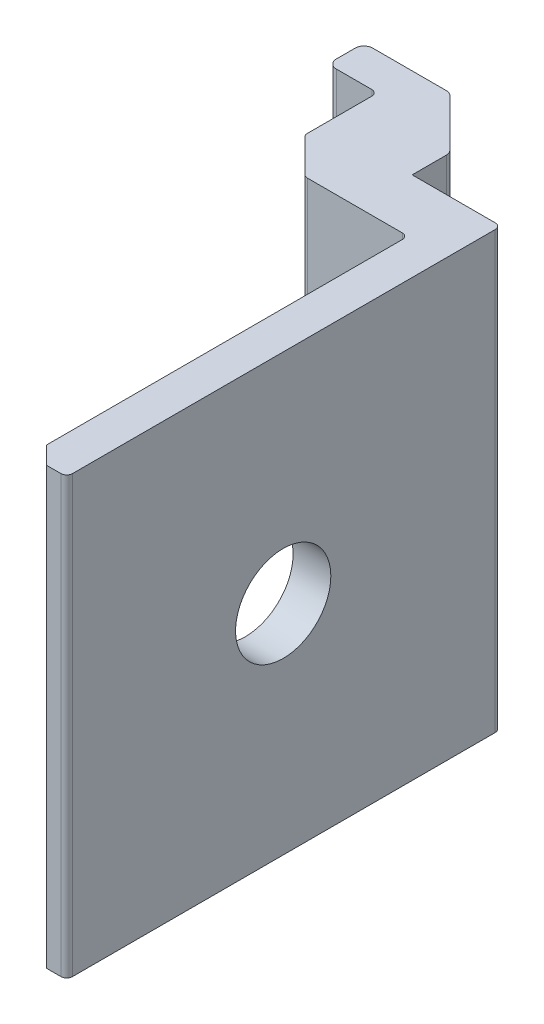
ISO-10303-21;
HEADER;
FILE_DESCRIPTION(('STEP AP214'),'2;1');
FILE_NAME('part.step','',(''),(''),'','','');
FILE_SCHEMA(('AUTOMOTIVE_DESIGN { 1 0 10303 214 1 1 1 1 }'));
ENDSEC;
DATA;
#1=APPLICATION_CONTEXT('core data for automotive mechanical design processes');
#2=APPLICATION_PROTOCOL_DEFINITION('international standard','automotive_design',2000,#1);
#3=PRODUCT_CONTEXT('',#1,'mechanical');
#4=PRODUCT('Part','Part','',(#3));
#5=PRODUCT_RELATED_PRODUCT_CATEGORY('part','',(#4));
#6=PRODUCT_DEFINITION_FORMATION('','',#4);
#7=PRODUCT_DEFINITION_CONTEXT('part definition',#1,'design');
#8=PRODUCT_DEFINITION('design','',#6,#7);
#9=PRODUCT_DEFINITION_SHAPE('','',#8);
#10=(LENGTH_UNIT() NAMED_UNIT(*) SI_UNIT(.MILLI.,.METRE.));
#11=(NAMED_UNIT(*) PLANE_ANGLE_UNIT() SI_UNIT($,.RADIAN.));
#12=(NAMED_UNIT(*) SI_UNIT($,.STERADIAN.) SOLID_ANGLE_UNIT());
#13=UNCERTAINTY_MEASURE_WITH_UNIT(LENGTH_MEASURE(1.E-05),#10,'distance_accuracy_value','');
#14=(GEOMETRIC_REPRESENTATION_CONTEXT(3) GLOBAL_UNCERTAINTY_ASSIGNED_CONTEXT((#13)) GLOBAL_UNIT_ASSIGNED_CONTEXT((#10,
#11,#12)) REPRESENTATION_CONTEXT('',''));
#15=CARTESIAN_POINT('',(0.,0.,0.));
#16=DIRECTION('',(0.,0.,1.));
#17=DIRECTION('',(1.,0.,0.));
#18=AXIS2_PLACEMENT_3D('',#15,#16,#17);
#19=CARTESIAN_POINT('',(-7.66487150235317,-38.1,-3.49745148248165));
#20=DIRECTION('',(0.707106781186537,0.,-0.707106781186558));
#21=DIRECTION('',(-0.707106781186558,0.,-0.707106781186537));
#22=AXIS2_PLACEMENT_3D('',#19,#20,#21);
#23=PLANE('',#22);
#24=DIRECTION('',(-0.707106781186558,0.,-0.707106781186537));
#25=VECTOR('',#24,1.);
#26=CARTESIAN_POINT('',(-7.66487150235317,0.,-3.49745148248165));
#27=LINE('',#26,#25);
#28=CARTESIAN_POINT('',(-7.88805613508904,0.,-3.72063611521751));
#29=VERTEX_POINT('',#28);
#30=CARTESIAN_POINT('',(-12.0136868696175,0.,-7.84626684974582));
#31=VERTEX_POINT('',#30);
#32=EDGE_CURVE('E237',#29,#31,#27,.T.);
#33=ORIENTED_EDGE('',*,*,#32,.F.);
#34=DIRECTION('',(0.,1.,0.));
#35=VECTOR('',#34,1.);
#36=CARTESIAN_POINT('',(-7.88805613508904,-38.1,-3.72063611521751));
#37=LINE('',#36,#35);
#38=CARTESIAN_POINT('',(-7.88805613508904,-38.1,-3.72063611521751));
#39=VERTEX_POINT('',#38);
#40=EDGE_CURVE('E329',#29,#39,#37,.F.);
#41=ORIENTED_EDGE('',*,*,#40,.T.);
#42=DIRECTION('',(-0.707106781186558,0.,-0.707106781186537));
#43=VECTOR('',#42,1.);
#44=CARTESIAN_POINT('',(-7.66487150235317,-38.1,-3.49745148248165));
#45=LINE('',#44,#43);
#46=CARTESIAN_POINT('',(-12.0136868696175,-38.1,-7.84626684974582));
#47=VERTEX_POINT('',#46);
#48=EDGE_CURVE('E377',#39,#47,#45,.T.);
#49=ORIENTED_EDGE('',*,*,#48,.T.);
#50=DIRECTION('',(0.,1.,0.));
#51=VECTOR('',#50,1.);
#52=CARTESIAN_POINT('',(-12.0136868696175,-38.1,-7.84626684974582));
#53=LINE('',#52,#51);
#54=EDGE_CURVE('E445',#47,#31,#53,.T.);
#55=ORIENTED_EDGE('',*,*,#54,.T.);
#56=EDGE_LOOP('',(#33,#41,#49,#55));
#57=FACE_BOUND('',#56,.T.);
#58=ADVANCED_FACE('F37',(#57),#23,.T.);
#59=CARTESIAN_POINT('',(-7.6648715023532,-38.1,-0.195451482481614));
#60=DIRECTION('',(1.,0.,0.));
#61=DIRECTION('',(0.,0.,-1.));
#62=AXIS2_PLACEMENT_3D('',#59,#60,#61);
#63=PLANE('',#62);
#64=DIRECTION('',(0.,0.,-1.));
#65=VECTOR('',#64,1.);
#66=CARTESIAN_POINT('',(-7.6648715023532,-38.1,-0.195451482481614));
#67=LINE('',#66,#65);
#68=CARTESIAN_POINT('',(-7.6648715023532,-38.1,-0.195451482481614));
#69=VERTEX_POINT('',#68);
#70=CARTESIAN_POINT('',(-7.66487150235318,-38.1,-3.18182074795334));
#71=VERTEX_POINT('',#70);
#72=EDGE_CURVE('E216',#69,#71,#67,.T.);
#73=ORIENTED_EDGE('',*,*,#72,.T.);
#74=DIRECTION('',(0.,1.,0.));
#75=VECTOR('',#74,1.);
#76=CARTESIAN_POINT('',(-7.66487150235318,-38.1,-3.18182074795334));
#77=LINE('',#76,#75);
#78=CARTESIAN_POINT('',(-7.66487150235318,0.,-3.18182074795334));
#79=VERTEX_POINT('',#78);
#80=EDGE_CURVE('E311',#71,#79,#77,.T.);
#81=ORIENTED_EDGE('',*,*,#80,.T.);
#82=DIRECTION('',(0.,0.,-1.));
#83=VECTOR('',#82,1.);
#84=CARTESIAN_POINT('',(-7.6648715023532,0.,-0.195451482481614));
#85=LINE('',#84,#83);
#86=CARTESIAN_POINT('',(-7.6648715023532,0.,-0.195451482481614));
#87=VERTEX_POINT('',#86);
#88=EDGE_CURVE('E381',#87,#79,#85,.T.);
#89=ORIENTED_EDGE('',*,*,#88,.F.);
#90=DIRECTION('',(0.,1.,0.));
#91=VECTOR('',#90,1.);
#92=CARTESIAN_POINT('',(-7.6648715023532,-38.1,-0.195451482481614));
#93=LINE('',#92,#91);
#94=EDGE_CURVE('E411',#69,#87,#93,.T.);
#95=ORIENTED_EDGE('',*,*,#94,.F.);
#96=EDGE_LOOP('',(#73,#81,#89,#95));
#97=FACE_BOUND('',#96,.T.);
#98=ADVANCED_FACE('F439',(#97),#63,.T.);
#99=CARTESIAN_POINT('',(0.107528497646751,-38.1,-0.195451482481621));
#100=DIRECTION('',(0.,0.,-1.));
#101=DIRECTION('',(-1.,0.,0.));
#102=AXIS2_PLACEMENT_3D('',#99,#100,#101);
#103=PLANE('',#102);
#104=DIRECTION('',(-1.,0.,0.));
#105=VECTOR('',#104,1.);
#106=CARTESIAN_POINT('',(0.107528497646751,0.,-0.195451482481621));
#107=LINE('',#106,#105);
#108=CARTESIAN_POINT('',(-0.40047150235325,0.,-0.19545148248162));
#109=VERTEX_POINT('',#108);
#110=EDGE_CURVE('E408',#109,#87,#107,.T.);
#111=ORIENTED_EDGE('',*,*,#110,.F.);
#112=DIRECTION('',(0.,1.,0.));
#113=VECTOR('',#112,1.);
#114=CARTESIAN_POINT('',(-0.40047150235325,-38.1,-0.19545148248162));
#115=LINE('',#114,#113);
#116=CARTESIAN_POINT('',(-0.40047150235325,-38.1,-0.19545148248162));
#117=VERTEX_POINT('',#116);
#118=EDGE_CURVE('E276',#109,#117,#115,.F.);
#119=ORIENTED_EDGE('',*,*,#118,.T.);
#120=DIRECTION('',(-1.,0.,0.));
#121=VECTOR('',#120,1.);
#122=CARTESIAN_POINT('',(0.107528497646751,-38.1,-0.195451482481621));
#123=LINE('',#122,#121);
#124=EDGE_CURVE('E233',#117,#69,#123,.T.);
#125=ORIENTED_EDGE('',*,*,#124,.T.);
#126=ORIENTED_EDGE('',*,*,#94,.T.);
#127=EDGE_LOOP('',(#111,#119,#125,#126));
#128=FACE_BOUND('',#127,.T.);
#129=ADVANCED_FACE('F434',(#128),#103,.T.);
#130=CARTESIAN_POINT('',(0.10752849764675,-38.1,37.7877085175183));
#131=DIRECTION('',(1.,0.,0.));
#132=DIRECTION('',(0.,0.,-1.));
#133=AXIS2_PLACEMENT_3D('',#130,#131,#132);
#134=PLANE('',#133);
#135=CARTESIAN_POINT('',(0.107528497646751,-19.05,18.8545485175184));
#136=DIRECTION('',(1.,0.,0.));
#137=DIRECTION('',(0.,0.,-1.));
#138=AXIS2_PLACEMENT_3D('',#135,#136,#137);
#139=CIRCLE('',#138,4.16560000000001);
#140=CARTESIAN_POINT('',(0.107528497646751,-19.05,14.6889485175183));
#141=VERTEX_POINT('',#140);
#142=EDGE_CURVE('E374',#141,#141,#139,.T.);
#143=ORIENTED_EDGE('',*,*,#142,.F.);
#144=EDGE_LOOP('',(#143));
#145=FACE_BOUND('',#144,.T.);
#146=DIRECTION('',(0.,0.,-1.));
#147=VECTOR('',#146,1.);
#148=CARTESIAN_POINT('',(0.10752849764675,-38.1,37.7877085175183));
#149=LINE('',#148,#147);
#150=CARTESIAN_POINT('',(0.10752849764675,-38.1,37.2797085175183));
#151=VERTEX_POINT('',#150);
#152=CARTESIAN_POINT('',(0.107528497646751,-38.1,0.312548517518378));
#153=VERTEX_POINT('',#152);
#154=EDGE_CURVE('E226',#151,#153,#149,.T.);
#155=ORIENTED_EDGE('',*,*,#154,.T.);
#156=DIRECTION('',(0.,1.,0.));
#157=VECTOR('',#156,1.);
#158=CARTESIAN_POINT('',(0.107528497646751,-38.1,0.312548517518378));
#159=LINE('',#158,#157);
#160=CARTESIAN_POINT('',(0.107528497646751,0.,0.312548517518378));
#161=VERTEX_POINT('',#160);
#162=EDGE_CURVE('E265',#153,#161,#159,.T.);
#163=ORIENTED_EDGE('',*,*,#162,.T.);
#164=DIRECTION('',(0.,0.,-1.));
#165=VECTOR('',#164,1.);
#166=CARTESIAN_POINT('',(0.10752849764675,0.,37.7877085175183));
#167=LINE('',#166,#165);
#168=CARTESIAN_POINT('',(0.10752849764675,0.,37.2797085175183));
#169=VERTEX_POINT('',#168);
#170=EDGE_CURVE('E405',#169,#161,#167,.T.);
#171=ORIENTED_EDGE('',*,*,#170,.F.);
#172=DIRECTION('',(0.,1.,0.));
#173=VECTOR('',#172,1.);
#174=CARTESIAN_POINT('',(0.10752849764675,-38.1,37.2797085175183));
#175=LINE('',#174,#173);
#176=EDGE_CURVE('E262',#169,#151,#175,.F.);
#177=ORIENTED_EDGE('',*,*,#176,.T.);
#178=EDGE_LOOP('',(#155,#163,#171,#177));
#179=FACE_BOUND('',#178,.T.);
#180=ADVANCED_FACE('F422',(#145,#179),#134,.T.);
#181=CARTESIAN_POINT('',(-1.67047150235335,-38.1,37.7877085175183));
#182=DIRECTION('',(0.,0.,1.));
#183=DIRECTION('',(1.,0.,0.));
#184=AXIS2_PLACEMENT_3D('',#181,#182,#183);
#185=PLANE('',#184);
#186=DIRECTION('',(1.,0.,0.));
#187=VECTOR('',#186,1.);
#188=CARTESIAN_POINT('',(-1.67047150235335,-38.1,37.7877085175183));
#189=LINE('',#188,#187);
#190=CARTESIAN_POINT('',(-1.67047150235335,-38.1,37.7877085175183));
#191=VERTEX_POINT('',#190);
#192=CARTESIAN_POINT('',(-0.400471502353258,-38.1,37.7877085175183));
#193=VERTEX_POINT('',#192);
#194=EDGE_CURVE('E222',#191,#193,#189,.T.);
#195=ORIENTED_EDGE('',*,*,#194,.T.);
#196=DIRECTION('',(0.,1.,0.));
#197=VECTOR('',#196,1.);
#198=CARTESIAN_POINT('',(-0.400471502353258,-38.1,37.7877085175183));
#199=LINE('',#198,#197);
#200=CARTESIAN_POINT('',(-0.400471502353258,0.,37.7877085175183));
#201=VERTEX_POINT('',#200);
#202=EDGE_CURVE('E287',#193,#201,#199,.T.);
#203=ORIENTED_EDGE('',*,*,#202,.T.);
#204=DIRECTION('',(1.,0.,0.));
#205=VECTOR('',#204,1.);
#206=CARTESIAN_POINT('',(-1.67047150235335,0.,37.7877085175183));
#207=LINE('',#206,#205);
#208=CARTESIAN_POINT('',(-1.67047150235335,0.,37.7877085175183));
#209=VERTEX_POINT('',#208);
#210=EDGE_CURVE('E400',#209,#201,#207,.T.);
#211=ORIENTED_EDGE('',*,*,#210,.F.);
#212=DIRECTION('',(0.,1.,0.));
#213=VECTOR('',#212,1.);
#214=CARTESIAN_POINT('',(-1.67047150235335,-38.1,37.7877085175183));
#215=LINE('',#214,#213);
#216=EDGE_CURVE('E215',#191,#209,#215,.T.);
#217=ORIENTED_EDGE('',*,*,#216,.F.);
#218=EDGE_LOOP('',(#195,#203,#211,#217));
#219=FACE_BOUND('',#218,.T.);
#220=ADVANCED_FACE('F416',(#219),#185,.T.);
#221=CARTESIAN_POINT('',(-3.1944715023533,-38.1,36.2637085175183));
#222=DIRECTION('',(-0.70710678118655,0.,0.707106781186545));
#223=DIRECTION('',(0.707106781186545,0.,0.70710678118655));
#224=AXIS2_PLACEMENT_3D('',#221,#222,#223);
#225=PLANE('',#224);
#226=DIRECTION('',(0.707106781186545,0.,0.70710678118655));
#227=VECTOR('',#226,1.);
#228=CARTESIAN_POINT('',(-3.1944715023533,0.,36.2637085175183));
#229=LINE('',#228,#227);
#230=CARTESIAN_POINT('',(-3.1944715023533,0.,36.2637085175183));
#231=VERTEX_POINT('',#230);
#232=EDGE_CURVE('E213',#231,#209,#229,.T.);
#233=ORIENTED_EDGE('',*,*,#232,.F.);
#234=DIRECTION('',(0.,1.,0.));
#235=VECTOR('',#234,1.);
#236=CARTESIAN_POINT('',(-3.1944715023533,-38.1,36.2637085175183));
#237=LINE('',#236,#235);
#238=CARTESIAN_POINT('',(-3.1944715023533,-38.1,36.2637085175183));
#239=VERTEX_POINT('',#238);
#240=EDGE_CURVE('E199',#239,#231,#237,.T.);
#241=ORIENTED_EDGE('',*,*,#240,.F.);
#242=DIRECTION('',(0.707106781186545,0.,0.70710678118655));
#243=VECTOR('',#242,1.);
#244=CARTESIAN_POINT('',(-3.1944715023533,-38.1,36.2637085175183));
#245=LINE('',#244,#243);
#246=EDGE_CURVE('E206',#239,#191,#245,.T.);
#247=ORIENTED_EDGE('',*,*,#246,.T.);
#248=ORIENTED_EDGE('',*,*,#216,.T.);
#249=EDGE_LOOP('',(#233,#241,#247,#248));
#250=FACE_BOUND('',#249,.T.);
#251=ADVANCED_FACE('F211',(#250),#225,.T.);
#252=CARTESIAN_POINT('',(-3.19447150235327,-38.1,4.63054851751842));
#253=DIRECTION('',(-1.,0.,0.));
#254=DIRECTION('',(0.,0.,1.));
#255=AXIS2_PLACEMENT_3D('',#252,#253,#254);
#256=PLANE('',#255);
#257=CARTESIAN_POINT('',(-3.19447150235328,-19.05,18.8545485175184));
#258=DIRECTION('',(-1.,0.,0.));
#259=DIRECTION('',(0.,0.,1.));
#260=AXIS2_PLACEMENT_3D('',#257,#258,#259);
#261=CIRCLE('',#260,4.16560000000001);
#262=CARTESIAN_POINT('',(-3.19447150235329,-19.05,23.0201485175184));
#263=VERTEX_POINT('',#262);
#264=EDGE_CURVE('E324',#263,#263,#261,.T.);
#265=ORIENTED_EDGE('',*,*,#264,.F.);
#266=EDGE_LOOP('',(#265));
#267=FACE_BOUND('',#266,.T.);
#268=DIRECTION('',(0.,0.,1.));
#269=VECTOR('',#268,1.);
#270=CARTESIAN_POINT('',(-3.19447150235327,0.,4.63054851751842));
#271=LINE('',#270,#269);
#272=CARTESIAN_POINT('',(-3.19447150235327,0.,5.13854851751842));
#273=VERTEX_POINT('',#272);
#274=EDGE_CURVE('E397',#273,#231,#271,.T.);
#275=ORIENTED_EDGE('',*,*,#274,.F.);
#276=DIRECTION('',(0.,1.,0.));
#277=VECTOR('',#276,1.);
#278=CARTESIAN_POINT('',(-3.19447150235327,-38.1,5.13854851751842));
#279=LINE('',#278,#277);
#280=CARTESIAN_POINT('',(-3.19447150235327,-38.1,5.13854851751842));
#281=VERTEX_POINT('',#280);
#282=EDGE_CURVE('E202',#273,#281,#279,.F.);
#283=ORIENTED_EDGE('',*,*,#282,.T.);
#284=DIRECTION('',(0.,0.,1.));
#285=VECTOR('',#284,1.);
#286=CARTESIAN_POINT('',(-3.19447150235327,-38.1,4.63054851751842));
#287=LINE('',#286,#285);
#288=EDGE_CURVE('E195',#281,#239,#287,.T.);
#289=ORIENTED_EDGE('',*,*,#288,.T.);
#290=ORIENTED_EDGE('',*,*,#240,.T.);
#291=EDGE_LOOP('',(#275,#283,#289,#290));
#292=FACE_BOUND('',#291,.T.);
#293=ADVANCED_FACE('F198',(#267,#292),#256,.T.);
#294=CARTESIAN_POINT('',(-12.2114715023532,-38.1,4.63054851751842));
#295=DIRECTION('',(0.,0.,1.));
#296=DIRECTION('',(1.,0.,0.));
#297=AXIS2_PLACEMENT_3D('',#294,#295,#296);
#298=PLANE('',#297);
#299=DIRECTION('',(1.,0.,0.));
#300=VECTOR('',#299,1.);
#301=CARTESIAN_POINT('',(-12.2114715023532,0.,4.63054851751842));
#302=LINE('',#301,#300);
#303=CARTESIAN_POINT('',(-12.0010510126677,0.,4.63054851751842));
#304=VERTEX_POINT('',#303);
#305=CARTESIAN_POINT('',(-3.70247150235327,0.,4.63054851751842));
#306=VERTEX_POINT('',#305);
#307=EDGE_CURVE('E398',#304,#306,#302,.T.);
#308=ORIENTED_EDGE('',*,*,#307,.F.);
#309=DIRECTION('',(0.,1.,0.));
#310=VECTOR('',#309,1.);
#311=CARTESIAN_POINT('',(-12.0010510126677,-38.1,4.63054851751842));
#312=LINE('',#311,#310);
#313=CARTESIAN_POINT('',(-12.0010510126677,-38.1,4.63054851751842));
#314=VERTEX_POINT('',#313);
#315=EDGE_CURVE('E299',#304,#314,#312,.F.);
#316=ORIENTED_EDGE('',*,*,#315,.T.);
#317=DIRECTION('',(1.,0.,0.));
#318=VECTOR('',#317,1.);
#319=CARTESIAN_POINT('',(-12.2114715023532,-38.1,4.63054851751842));
#320=LINE('',#319,#318);
#321=CARTESIAN_POINT('',(-3.70247150235327,-38.1,4.63054851751842));
#322=VERTEX_POINT('',#321);
#323=EDGE_CURVE('E207',#314,#322,#320,.T.);
#324=ORIENTED_EDGE('',*,*,#323,.T.);
#325=DIRECTION('',(0.,1.,0.));
#326=VECTOR('',#325,1.);
#327=CARTESIAN_POINT('',(-3.70247150235327,0.,4.63054851751842));
#328=LINE('',#327,#326);
#329=EDGE_CURVE('E296',#322,#306,#328,.T.);
#330=ORIENTED_EDGE('',*,*,#329,.T.);
#331=EDGE_LOOP('',(#308,#316,#324,#330));
#332=FACE_BOUND('',#331,.T.);
#333=ADVANCED_FACE('F391',(#332),#298,.T.);
#334=CARTESIAN_POINT('',(-15.3864715023532,-38.1,1.45554851751837));
#335=DIRECTION('',(-0.707106781186548,0.,0.707106781186547));
#336=DIRECTION('',(0.707106781186547,0.,0.707106781186548));
#337=AXIS2_PLACEMENT_3D('',#334,#335,#336);
#338=PLANE('',#337);
#339=DIRECTION('',(0.707106781186547,0.,0.707106781186548));
#340=VECTOR('',#339,1.);
#341=CARTESIAN_POINT('',(-15.3864715023532,-38.1,1.45554851751837));
#342=LINE('',#341,#340);
#343=CARTESIAN_POINT('',(-15.237681747196,-38.1,1.6043382726756));
#344=VERTEX_POINT('',#343);
#345=CARTESIAN_POINT('',(-12.3602612575104,-38.1,4.48175876236118));
#346=VERTEX_POINT('',#345);
#347=EDGE_CURVE('E384',#344,#346,#342,.T.);
#348=ORIENTED_EDGE('',*,*,#347,.T.);
#349=DIRECTION('',(0.,1.,0.));
#350=VECTOR('',#349,1.);
#351=CARTESIAN_POINT('',(-12.3602612575104,-38.1,4.48175876236118));
#352=LINE('',#351,#350);
#353=CARTESIAN_POINT('',(-12.3602612575104,0.,4.48175876236118));
#354=VERTEX_POINT('',#353);
#355=EDGE_CURVE('E293',#346,#354,#352,.T.);
#356=ORIENTED_EDGE('',*,*,#355,.T.);
#357=DIRECTION('',(0.707106781186547,0.,0.707106781186548));
#358=VECTOR('',#357,1.);
#359=CARTESIAN_POINT('',(-15.3864715023532,0.,1.45554851751837));
#360=LINE('',#359,#358);
#361=CARTESIAN_POINT('',(-15.237681747196,0.,1.6043382726756));
#362=VERTEX_POINT('',#361);
#363=EDGE_CURVE('E247',#362,#354,#360,.T.);
#364=ORIENTED_EDGE('',*,*,#363,.F.);
#365=DIRECTION('',(0.,1.,0.));
#366=VECTOR('',#365,1.);
#367=CARTESIAN_POINT('',(-15.237681747196,-38.1,1.6043382726756));
#368=LINE('',#367,#366);
#369=EDGE_CURVE('E291',#362,#344,#368,.F.);
#370=ORIENTED_EDGE('',*,*,#369,.T.);
#371=EDGE_LOOP('',(#348,#356,#364,#370));
#372=FACE_BOUND('',#371,.T.);
#373=ADVANCED_FACE('F649',(#372),#338,.T.);
#374=CARTESIAN_POINT('',(-15.3864715023534,-38.1,-8.06945148248188));
#375=DIRECTION('',(-1.,0.,0.));
#376=DIRECTION('',(0.,0.,1.));
#377=AXIS2_PLACEMENT_3D('',#374,#375,#376);
#378=PLANE('',#377);
#379=DIRECTION('',(0.,0.,1.));
#380=VECTOR('',#379,1.);
#381=CARTESIAN_POINT('',(-15.3864715023534,0.,-8.06945148248188));
#382=LINE('',#381,#380);
#383=CARTESIAN_POINT('',(-15.3864715023533,0.,-4.38645148248196));
#384=VERTEX_POINT('',#383);
#385=CARTESIAN_POINT('',(-15.3864715023532,0.,1.24512802783285));
#386=VERTEX_POINT('',#385);
#387=EDGE_CURVE('E244',#384,#386,#382,.T.);
#388=ORIENTED_EDGE('',*,*,#387,.F.);
#389=DIRECTION('',(0.,1.,0.));
#390=VECTOR('',#389,1.);
#391=CARTESIAN_POINT('',(-15.3864715023533,-38.1,-4.38645148248193));
#392=LINE('',#391,#390);
#393=CARTESIAN_POINT('',(-15.3864715023533,-38.1,-4.38645148248193));
#394=VERTEX_POINT('',#393);
#395=EDGE_CURVE('E259',#384,#394,#392,.F.);
#396=ORIENTED_EDGE('',*,*,#395,.T.);
#397=DIRECTION('',(0.,0.,1.));
#398=VECTOR('',#397,1.);
#399=CARTESIAN_POINT('',(-15.3864715023534,-38.1,-8.06945148248188));
#400=LINE('',#399,#398);
#401=CARTESIAN_POINT('',(-15.3864715023532,-38.1,1.24512802783285));
#402=VERTEX_POINT('',#401);
#403=EDGE_CURVE('E253',#394,#402,#400,.T.);
#404=ORIENTED_EDGE('',*,*,#403,.T.);
#405=DIRECTION('',(0.,1.,0.));
#406=VECTOR('',#405,1.);
#407=CARTESIAN_POINT('',(-15.3864715023532,-38.1,1.24512802783285));
#408=LINE('',#407,#406);
#409=EDGE_CURVE('E256',#402,#386,#408,.T.);
#410=ORIENTED_EDGE('',*,*,#409,.T.);
#411=EDGE_LOOP('',(#388,#396,#404,#410));
#412=FACE_BOUND('',#411,.T.);
#413=ADVANCED_FACE('F598',(#412),#378,.T.);
#414=CARTESIAN_POINT('',(-12.2368715023533,-38.1,-8.06945148248164));
#415=DIRECTION('',(0.,0.,-1.));
#416=DIRECTION('',(-1.,0.,0.));
#417=AXIS2_PLACEMENT_3D('',#414,#415,#416);
#418=PLANE('',#417);
#419=DIRECTION('',(-1.,0.,0.));
#420=VECTOR('',#419,1.);
#421=CARTESIAN_POINT('',(-12.2368715023533,-38.1,-8.06945148248164));
#422=LINE('',#421,#420);
#423=CARTESIAN_POINT('',(-12.5525022368815,-38.1,-8.06945148248166));
#424=VERTEX_POINT('',#423);
#425=CARTESIAN_POINT('',(-18.9932715023532,-38.1,-8.06945148248215));
#426=VERTEX_POINT('',#425);
#427=EDGE_CURVE('E380',#424,#426,#422,.T.);
#428=ORIENTED_EDGE('',*,*,#427,.T.);
#429=DIRECTION('',(0.,-1.,0.));
#430=VECTOR('',#429,1.);
#431=CARTESIAN_POINT('',(-18.9932715023532,0.,-8.06945148248215));
#432=LINE('',#431,#430);
#433=CARTESIAN_POINT('',(-18.9932715023532,0.,-8.06945148248215));
#434=VERTEX_POINT('',#433);
#435=EDGE_CURVE('E11',#426,#434,#432,.F.);
#436=ORIENTED_EDGE('',*,*,#435,.T.);
#437=DIRECTION('',(-1.,0.,0.));
#438=VECTOR('',#437,1.);
#439=CARTESIAN_POINT('',(-12.2368715023533,0.,-8.06945148248164));
#440=LINE('',#439,#438);
#441=CARTESIAN_POINT('',(-12.5525022368815,0.,-8.06945148248166));
#442=VERTEX_POINT('',#441);
#443=EDGE_CURVE('E240',#442,#434,#440,.T.);
#444=ORIENTED_EDGE('',*,*,#443,.F.);
#445=DIRECTION('',(0.,1.,0.));
#446=VECTOR('',#445,1.);
#447=CARTESIAN_POINT('',(-12.5525022368815,-38.1,-8.06945148248166));
#448=LINE('',#447,#446);
#449=EDGE_CURVE('E45',#442,#424,#448,.F.);
#450=ORIENTED_EDGE('',*,*,#449,.T.);
#451=EDGE_LOOP('',(#428,#436,#444,#450));
#452=FACE_BOUND('',#451,.T.);
#453=ADVANCED_FACE('F454',(#452),#418,.T.);
#454=CARTESIAN_POINT('',(-12.2368715023533,-38.1,-8.06945148248164));
#455=DIRECTION('',(0.,1.,0.));
#456=DIRECTION('',(0.,0.,1.));
#457=AXIS2_PLACEMENT_3D('',#454,#455,#456);
#458=PLANE('',#457);
#459=ORIENTED_EDGE('',*,*,#48,.F.);
#460=CARTESIAN_POINT('',(-8.42687150235318,-38.1,-3.18182074795335));
#461=DIRECTION('',(0.,1.,0.));
#462=DIRECTION('',(0.,0.,1.));
#463=AXIS2_PLACEMENT_3D('',#460,#461,#462);
#464=CIRCLE('',#463,0.762);
#465=EDGE_CURVE('E336',#39,#71,#464,.F.);
#466=ORIENTED_EDGE('',*,*,#465,.T.);
#467=ORIENTED_EDGE('',*,*,#72,.F.);
#468=ORIENTED_EDGE('',*,*,#124,.F.);
#469=CARTESIAN_POINT('',(-0.400471502353249,-38.1,0.312548517518378));
#470=DIRECTION('',(0.,1.,0.));
#471=DIRECTION('',(0.,0.,1.));
#472=AXIS2_PLACEMENT_3D('',#469,#470,#471);
#473=CIRCLE('',#472,0.508);
#474=EDGE_CURVE('E285',#117,#153,#473,.F.);
#475=ORIENTED_EDGE('',*,*,#474,.T.);
#476=ORIENTED_EDGE('',*,*,#154,.F.);
#477=CARTESIAN_POINT('',(-0.40047150235325,-38.1,37.2797085175183));
#478=DIRECTION('',(0.,1.,0.));
#479=DIRECTION('',(0.,0.,1.));
#480=AXIS2_PLACEMENT_3D('',#477,#478,#479);
#481=CIRCLE('',#480,0.508);
#482=EDGE_CURVE('E282',#151,#193,#481,.F.);
#483=ORIENTED_EDGE('',*,*,#482,.T.);
#484=ORIENTED_EDGE('',*,*,#194,.F.);
#485=ORIENTED_EDGE('',*,*,#246,.F.);
#486=ORIENTED_EDGE('',*,*,#288,.F.);
#487=CARTESIAN_POINT('',(-3.70247150235327,-38.1,5.13854851751842));
#488=DIRECTION('',(0.,1.,0.));
#489=DIRECTION('',(0.,0.,1.));
#490=AXIS2_PLACEMENT_3D('',#487,#488,#489);
#491=CIRCLE('',#490,0.508);
#492=EDGE_CURVE('E309',#281,#322,#491,.T.);
#493=ORIENTED_EDGE('',*,*,#492,.T.);
#494=ORIENTED_EDGE('',*,*,#323,.F.);
#495=CARTESIAN_POINT('',(-12.0010510126677,-38.1,4.12254851751842));
#496=DIRECTION('',(0.,1.,0.));
#497=DIRECTION('',(0.,0.,1.));
#498=AXIS2_PLACEMENT_3D('',#495,#496,#497);
#499=CIRCLE('',#498,0.508);
#500=EDGE_CURVE('E280',#314,#346,#499,.F.);
#501=ORIENTED_EDGE('',*,*,#500,.T.);
#502=ORIENTED_EDGE('',*,*,#347,.F.);
#503=CARTESIAN_POINT('',(-14.8784715023532,-38.1,1.24512802783284));
#504=DIRECTION('',(0.,1.,0.));
#505=DIRECTION('',(0.,0.,1.));
#506=AXIS2_PLACEMENT_3D('',#503,#504,#505);
#507=CIRCLE('',#506,0.508);
#508=EDGE_CURVE('E278',#344,#402,#507,.F.);
#509=ORIENTED_EDGE('',*,*,#508,.T.);
#510=ORIENTED_EDGE('',*,*,#403,.F.);
#511=CARTESIAN_POINT('',(-15.8944715023533,-38.1,-4.38645148248193));
#512=DIRECTION('',(0.,1.,0.));
#513=DIRECTION('',(0.,0.,1.));
#514=AXIS2_PLACEMENT_3D('',#511,#512,#513);
#515=CIRCLE('',#514,0.508);
#516=CARTESIAN_POINT('',(-15.8944715023533,-38.1,-4.89445148248193));
#517=VERTEX_POINT('',#516);
#518=EDGE_CURVE('E304',#394,#517,#515,.T.);
#519=ORIENTED_EDGE('',*,*,#518,.T.);
#520=DIRECTION('',(1.,0.,0.));
#521=VECTOR('',#520,1.);
#522=CARTESIAN_POINT('',(-19.7552715023532,-38.1,-4.89445148248186));
#523=LINE('',#522,#521);
#524=CARTESIAN_POINT('',(-18.9932715023532,-38.1,-4.89445148248187));
#525=VERTEX_POINT('',#524);
#526=EDGE_CURVE('E317',#525,#517,#523,.T.);
#527=ORIENTED_EDGE('',*,*,#526,.F.);
#528=CARTESIAN_POINT('',(-18.9932715023532,-38.1,-5.65645148248187));
#529=DIRECTION('',(0.,1.,0.));
#530=DIRECTION('',(0.,0.,1.));
#531=AXIS2_PLACEMENT_3D('',#528,#529,#530);
#532=CIRCLE('',#531,0.762);
#533=CARTESIAN_POINT('',(-19.7552715023532,-38.1,-5.65645148248186));
#534=VERTEX_POINT('',#533);
#535=EDGE_CURVE('E334',#525,#534,#532,.F.);
#536=ORIENTED_EDGE('',*,*,#535,.T.);
#537=DIRECTION('',(0.,0.,1.));
#538=VECTOR('',#537,1.);
#539=CARTESIAN_POINT('',(-19.7552715023532,-38.1,-4.89445148248186));
#540=LINE('',#539,#538);
#541=CARTESIAN_POINT('',(-19.7552715023532,-38.1,-7.30745148248214));
#542=VERTEX_POINT('',#541);
#543=EDGE_CURVE('E328',#542,#534,#540,.T.);
#544=ORIENTED_EDGE('',*,*,#543,.F.);
#545=CARTESIAN_POINT('',(-18.9932715023533,-38.1,-7.30745148248215));
#546=DIRECTION('',(0.,1.,0.));
#547=DIRECTION('',(0.,0.,1.));
#548=AXIS2_PLACEMENT_3D('',#545,#546,#547);
#549=CIRCLE('',#548,0.762);
#550=EDGE_CURVE('E52',#542,#426,#549,.F.);
#551=ORIENTED_EDGE('',*,*,#550,.T.);
#552=ORIENTED_EDGE('',*,*,#427,.F.);
#553=CARTESIAN_POINT('',(-12.5525022368816,-38.1,-7.30745148248166));
#554=DIRECTION('',(0.,1.,0.));
#555=DIRECTION('',(0.,0.,1.));
#556=AXIS2_PLACEMENT_3D('',#553,#554,#555);
#557=CIRCLE('',#556,0.762);
#558=EDGE_CURVE('E331',#424,#47,#557,.F.);
#559=ORIENTED_EDGE('',*,*,#558,.T.);
#560=EDGE_LOOP('',(#459,#466,#467,#468,#475,#476,#483,#484,#485,#486,#493,#494,#501,#502,#509,
#510,#519,#527,#536,#544,#551,#552,#559));
#561=FACE_BOUND('',#560,.T.);
#562=ADVANCED_FACE('F220',(#561),#458,.F.);
#563=CARTESIAN_POINT('',(-12.2368715023533,0.,-8.06945148248164));
#564=DIRECTION('',(0.,1.,0.));
#565=DIRECTION('',(0.,0.,1.));
#566=AXIS2_PLACEMENT_3D('',#563,#564,#565);
#567=PLANE('',#566);
#568=ORIENTED_EDGE('',*,*,#88,.T.);
#569=CARTESIAN_POINT('',(-8.42687150235318,0.,-3.18182074795335));
#570=DIRECTION('',(0.,1.,0.));
#571=DIRECTION('',(0.,0.,1.));
#572=AXIS2_PLACEMENT_3D('',#569,#570,#571);
#573=CIRCLE('',#572,0.762);
#574=EDGE_CURVE('E441',#79,#29,#573,.T.);
#575=ORIENTED_EDGE('',*,*,#574,.T.);
#576=ORIENTED_EDGE('',*,*,#32,.T.);
#577=CARTESIAN_POINT('',(-12.5525022368816,0.,-7.30745148248166));
#578=DIRECTION('',(0.,1.,0.));
#579=DIRECTION('',(0.,0.,1.));
#580=AXIS2_PLACEMENT_3D('',#577,#578,#579);
#581=CIRCLE('',#580,0.762);
#582=EDGE_CURVE('E314',#31,#442,#581,.T.);
#583=ORIENTED_EDGE('',*,*,#582,.T.);
#584=ORIENTED_EDGE('',*,*,#443,.T.);
#585=CARTESIAN_POINT('',(-18.9932715023533,0.,-7.30745148248215));
#586=DIRECTION('',(0.,1.,0.));
#587=DIRECTION('',(0.,0.,1.));
#588=AXIS2_PLACEMENT_3D('',#585,#586,#587);
#589=CIRCLE('',#588,0.762);
#590=CARTESIAN_POINT('',(-19.7552715023532,0.,-7.30745148248214));
#591=VERTEX_POINT('',#590);
#592=EDGE_CURVE('E370',#434,#591,#589,.T.);
#593=ORIENTED_EDGE('',*,*,#592,.T.);
#594=DIRECTION('',(0.,0.,-1.));
#595=VECTOR('',#594,1.);
#596=CARTESIAN_POINT('',(-19.7552715023533,0.,-8.0694514824818));
#597=LINE('',#596,#595);
#598=CARTESIAN_POINT('',(-19.7552715023532,0.,-5.65645148248188));
#599=VERTEX_POINT('',#598);
#600=EDGE_CURVE('E364',#599,#591,#597,.T.);
#601=ORIENTED_EDGE('',*,*,#600,.F.);
#602=CARTESIAN_POINT('',(-18.9932715023532,0.,-5.65645148248189));
#603=DIRECTION('',(0.,1.,0.));
#604=DIRECTION('',(0.,0.,1.));
#605=AXIS2_PLACEMENT_3D('',#602,#603,#604);
#606=CIRCLE('',#605,0.762);
#607=CARTESIAN_POINT('',(-18.9932715023532,0.,-4.89445148248189));
#608=VERTEX_POINT('',#607);
#609=EDGE_CURVE('E359',#599,#608,#606,.T.);
#610=ORIENTED_EDGE('',*,*,#609,.T.);
#611=DIRECTION('',(1.,0.,0.));
#612=VECTOR('',#611,1.);
#613=CARTESIAN_POINT('',(-19.7552715023532,0.,-4.89445148248188));
#614=LINE('',#613,#612);
#615=CARTESIAN_POINT('',(-15.8944715023533,0.,-4.89445148248195));
#616=VERTEX_POINT('',#615);
#617=EDGE_CURVE('E241',#608,#616,#614,.T.);
#618=ORIENTED_EDGE('',*,*,#617,.T.);
#619=CARTESIAN_POINT('',(-15.8944715023533,0.,-4.38645148248195));
#620=DIRECTION('',(0.,1.,0.));
#621=DIRECTION('',(0.,0.,1.));
#622=AXIS2_PLACEMENT_3D('',#619,#620,#621);
#623=CIRCLE('',#622,0.508);
#624=EDGE_CURVE('E302',#616,#384,#623,.F.);
#625=ORIENTED_EDGE('',*,*,#624,.T.);
#626=ORIENTED_EDGE('',*,*,#387,.T.);
#627=CARTESIAN_POINT('',(-14.8784715023532,0.,1.24512802783284));
#628=DIRECTION('',(0.,1.,0.));
#629=DIRECTION('',(0.,0.,1.));
#630=AXIS2_PLACEMENT_3D('',#627,#628,#629);
#631=CIRCLE('',#630,0.508);
#632=EDGE_CURVE('E268',#386,#362,#631,.T.);
#633=ORIENTED_EDGE('',*,*,#632,.T.);
#634=ORIENTED_EDGE('',*,*,#363,.T.);
#635=CARTESIAN_POINT('',(-12.0010510126677,0.,4.12254851751842));
#636=DIRECTION('',(0.,1.,0.));
#637=DIRECTION('',(0.,0.,1.));
#638=AXIS2_PLACEMENT_3D('',#635,#636,#637);
#639=CIRCLE('',#638,0.508);
#640=EDGE_CURVE('E270',#354,#304,#639,.T.);
#641=ORIENTED_EDGE('',*,*,#640,.T.);
#642=ORIENTED_EDGE('',*,*,#307,.T.);
#643=CARTESIAN_POINT('',(-3.70247150235327,0.,5.13854851751842));
#644=DIRECTION('',(0.,1.,0.));
#645=DIRECTION('',(0.,0.,1.));
#646=AXIS2_PLACEMENT_3D('',#643,#644,#645);
#647=CIRCLE('',#646,0.508);
#648=EDGE_CURVE('E307',#306,#273,#647,.F.);
#649=ORIENTED_EDGE('',*,*,#648,.T.);
#650=ORIENTED_EDGE('',*,*,#274,.T.);
#651=ORIENTED_EDGE('',*,*,#232,.T.);
#652=ORIENTED_EDGE('',*,*,#210,.T.);
#653=CARTESIAN_POINT('',(-0.40047150235325,0.,37.2797085175183));
#654=DIRECTION('',(0.,1.,0.));
#655=DIRECTION('',(0.,0.,1.));
#656=AXIS2_PLACEMENT_3D('',#653,#654,#655);
#657=CIRCLE('',#656,0.508);
#658=EDGE_CURVE('E272',#201,#169,#657,.T.);
#659=ORIENTED_EDGE('',*,*,#658,.T.);
#660=ORIENTED_EDGE('',*,*,#170,.T.);
#661=CARTESIAN_POINT('',(-0.400471502353249,0.,0.312548517518378));
#662=DIRECTION('',(0.,1.,0.));
#663=DIRECTION('',(0.,0.,1.));
#664=AXIS2_PLACEMENT_3D('',#661,#662,#663);
#665=CIRCLE('',#664,0.508);
#666=EDGE_CURVE('E274',#161,#109,#665,.T.);
#667=ORIENTED_EDGE('',*,*,#666,.T.);
#668=ORIENTED_EDGE('',*,*,#110,.T.);
#669=EDGE_LOOP('',(#568,#575,#576,#583,#584,#593,#601,#610,#618,#625,#626,#633,#634,#641,#642,
#649,#650,#651,#652,#659,#660,#667,#668));
#670=FACE_BOUND('',#669,.T.);
#671=ADVANCED_FACE('F368',(#670),#567,.T.);
#672=CARTESIAN_POINT('',(-19.7552715023532,0.,-4.89445148248188));
#673=DIRECTION('',(0.,0.,-1.));
#674=DIRECTION('',(-1.,0.,0.));
#675=AXIS2_PLACEMENT_3D('',#672,#673,#674);
#676=PLANE('',#675);
#677=ORIENTED_EDGE('',*,*,#617,.F.);
#678=DIRECTION('',(0.,1.,0.));
#679=VECTOR('',#678,1.);
#680=CARTESIAN_POINT('',(-18.9932715023532,0.,-4.89445148248189));
#681=LINE('',#680,#679);
#682=EDGE_CURVE('E344',#608,#525,#681,.F.);
#683=ORIENTED_EDGE('',*,*,#682,.T.);
#684=ORIENTED_EDGE('',*,*,#526,.T.);
#685=DIRECTION('',(0.,1.,0.));
#686=VECTOR('',#685,1.);
#687=CARTESIAN_POINT('',(-15.8944715023533,0.,-4.89445148248195));
#688=LINE('',#687,#686);
#689=EDGE_CURVE('E260',#517,#616,#688,.T.);
#690=ORIENTED_EDGE('',*,*,#689,.T.);
#691=EDGE_LOOP('',(#677,#683,#684,#690));
#692=FACE_BOUND('',#691,.T.);
#693=ADVANCED_FACE('F349',(#692),#676,.F.);
#694=CARTESIAN_POINT('',(-19.7552715023532,-38.1,-4.89445148248186));
#695=DIRECTION('',(1.,0.,0.));
#696=DIRECTION('',(0.,0.,-1.));
#697=AXIS2_PLACEMENT_3D('',#694,#695,#696);
#698=PLANE('',#697);
#699=ORIENTED_EDGE('',*,*,#543,.T.);
#700=DIRECTION('',(0.,1.,0.));
#701=VECTOR('',#700,1.);
#702=CARTESIAN_POINT('',(-19.7552715023532,-38.1,-5.65645148248186));
#703=LINE('',#702,#701);
#704=EDGE_CURVE('E341',#534,#599,#703,.T.);
#705=ORIENTED_EDGE('',*,*,#704,.T.);
#706=ORIENTED_EDGE('',*,*,#600,.T.);
#707=DIRECTION('',(0.,-1.,0.));
#708=VECTOR('',#707,1.);
#709=CARTESIAN_POINT('',(-19.7552715023532,-38.1,-7.30745148248214));
#710=LINE('',#709,#708);
#711=EDGE_CURVE('E338',#591,#542,#710,.T.);
#712=ORIENTED_EDGE('',*,*,#711,.T.);
#713=EDGE_LOOP('',(#699,#705,#706,#712));
#714=FACE_BOUND('',#713,.T.);
#715=ADVANCED_FACE('F363',(#714),#698,.F.);
#716=CARTESIAN_POINT('',(0.107528497646751,-19.05,18.8545485175184));
#717=DIRECTION('',(1.,0.,0.));
#718=DIRECTION('',(0.,0.,-1.));
#719=AXIS2_PLACEMENT_3D('',#716,#717,#718);
#720=CYLINDRICAL_SURFACE('',#719,4.16560000000001);
#721=ORIENTED_EDGE('',*,*,#264,.T.);
#722=EDGE_LOOP('',(#721));
#723=FACE_BOUND('',#722,.T.);
#724=ORIENTED_EDGE('',*,*,#142,.T.);
#725=EDGE_LOOP('',(#724));
#726=FACE_BOUND('',#725,.T.);
#727=ADVANCED_FACE('F477',(#723,#726),#720,.F.);
#728=CARTESIAN_POINT('',(-15.8944715023533,0.,-4.38645148248195));
#729=DIRECTION('',(0.,1.,0.));
#730=DIRECTION('',(0.,0.,1.));
#731=AXIS2_PLACEMENT_3D('',#728,#729,#730);
#732=CYLINDRICAL_SURFACE('',#731,0.508);
#733=ORIENTED_EDGE('',*,*,#518,.F.);
#734=ORIENTED_EDGE('',*,*,#395,.F.);
#735=ORIENTED_EDGE('',*,*,#624,.F.);
#736=ORIENTED_EDGE('',*,*,#689,.F.);
#737=EDGE_LOOP('',(#733,#734,#735,#736));
#738=FACE_BOUND('',#737,.T.);
#739=ADVANCED_FACE('F474',(#738),#732,.F.);
#740=CARTESIAN_POINT('',(-0.400471502353249,-38.1,0.312548517518378));
#741=DIRECTION('',(0.,1.,0.));
#742=DIRECTION('',(0.,0.,1.));
#743=AXIS2_PLACEMENT_3D('',#740,#741,#742);
#744=CYLINDRICAL_SURFACE('',#743,0.508);
#745=ORIENTED_EDGE('',*,*,#474,.F.);
#746=ORIENTED_EDGE('',*,*,#118,.F.);
#747=ORIENTED_EDGE('',*,*,#666,.F.);
#748=ORIENTED_EDGE('',*,*,#162,.F.);
#749=EDGE_LOOP('',(#745,#746,#747,#748));
#750=FACE_BOUND('',#749,.T.);
#751=ADVANCED_FACE('F430',(#750),#744,.T.);
#752=CARTESIAN_POINT('',(-0.40047150235325,-38.1,37.2797085175183));
#753=DIRECTION('',(0.,1.,0.));
#754=DIRECTION('',(0.,0.,1.));
#755=AXIS2_PLACEMENT_3D('',#752,#753,#754);
#756=CYLINDRICAL_SURFACE('',#755,0.508);
#757=ORIENTED_EDGE('',*,*,#482,.F.);
#758=ORIENTED_EDGE('',*,*,#176,.F.);
#759=ORIENTED_EDGE('',*,*,#658,.F.);
#760=ORIENTED_EDGE('',*,*,#202,.F.);
#761=EDGE_LOOP('',(#757,#758,#759,#760));
#762=FACE_BOUND('',#761,.T.);
#763=ADVANCED_FACE('F426',(#762),#756,.T.);
#764=CARTESIAN_POINT('',(-12.0010510126677,-38.1,4.12254851751842));
#765=DIRECTION('',(0.,1.,0.));
#766=DIRECTION('',(0.,0.,1.));
#767=AXIS2_PLACEMENT_3D('',#764,#765,#766);
#768=CYLINDRICAL_SURFACE('',#767,0.508);
#769=ORIENTED_EDGE('',*,*,#500,.F.);
#770=ORIENTED_EDGE('',*,*,#315,.F.);
#771=ORIENTED_EDGE('',*,*,#640,.F.);
#772=ORIENTED_EDGE('',*,*,#355,.F.);
#773=EDGE_LOOP('',(#769,#770,#771,#772));
#774=FACE_BOUND('',#773,.T.);
#775=ADVANCED_FACE('F483',(#774),#768,.T.);
#776=CARTESIAN_POINT('',(-3.70247150235327,-38.1,5.13854851751842));
#777=DIRECTION('',(0.,-1.,0.));
#778=DIRECTION('',(0.,0.,-1.));
#779=AXIS2_PLACEMENT_3D('',#776,#777,#778);
#780=CYLINDRICAL_SURFACE('',#779,0.508);
#781=ORIENTED_EDGE('',*,*,#492,.F.);
#782=ORIENTED_EDGE('',*,*,#282,.F.);
#783=ORIENTED_EDGE('',*,*,#648,.F.);
#784=ORIENTED_EDGE('',*,*,#329,.F.);
#785=EDGE_LOOP('',(#781,#782,#783,#784));
#786=FACE_BOUND('',#785,.T.);
#787=ADVANCED_FACE('F396',(#786),#780,.F.);
#788=CARTESIAN_POINT('',(-14.8784715023532,-38.1,1.24512802783284));
#789=DIRECTION('',(0.,1.,0.));
#790=DIRECTION('',(0.,0.,1.));
#791=AXIS2_PLACEMENT_3D('',#788,#789,#790);
#792=CYLINDRICAL_SURFACE('',#791,0.508);
#793=ORIENTED_EDGE('',*,*,#508,.F.);
#794=ORIENTED_EDGE('',*,*,#369,.F.);
#795=ORIENTED_EDGE('',*,*,#632,.F.);
#796=ORIENTED_EDGE('',*,*,#409,.F.);
#797=EDGE_LOOP('',(#793,#794,#795,#796));
#798=FACE_BOUND('',#797,.T.);
#799=ADVANCED_FACE('F489',(#798),#792,.T.);
#800=CARTESIAN_POINT('',(-8.42687150235318,-38.1,-3.18182074795335));
#801=DIRECTION('',(0.,1.,0.));
#802=DIRECTION('',(0.,0.,1.));
#803=AXIS2_PLACEMENT_3D('',#800,#801,#802);
#804=CYLINDRICAL_SURFACE('',#803,0.762);
#805=ORIENTED_EDGE('',*,*,#465,.F.);
#806=ORIENTED_EDGE('',*,*,#40,.F.);
#807=ORIENTED_EDGE('',*,*,#574,.F.);
#808=ORIENTED_EDGE('',*,*,#80,.F.);
#809=EDGE_LOOP('',(#805,#806,#807,#808));
#810=FACE_BOUND('',#809,.T.);
#811=ADVANCED_FACE('F451',(#810),#804,.T.);
#812=CARTESIAN_POINT('',(-18.9932715023532,-38.1,-5.65645148248187));
#813=DIRECTION('',(0.,1.,0.));
#814=DIRECTION('',(0.,0.,1.));
#815=AXIS2_PLACEMENT_3D('',#812,#813,#814);
#816=CYLINDRICAL_SURFACE('',#815,0.762);
#817=ORIENTED_EDGE('',*,*,#535,.F.);
#818=ORIENTED_EDGE('',*,*,#682,.F.);
#819=ORIENTED_EDGE('',*,*,#609,.F.);
#820=ORIENTED_EDGE('',*,*,#704,.F.);
#821=EDGE_LOOP('',(#817,#818,#819,#820));
#822=FACE_BOUND('',#821,.T.);
#823=ADVANCED_FACE('F358',(#822),#816,.T.);
#824=CARTESIAN_POINT('',(-18.9932715023533,-38.1,-7.30745148248215));
#825=DIRECTION('',(0.,1.,0.));
#826=DIRECTION('',(-1.,0.,0.));
#827=AXIS2_PLACEMENT_3D('',#824,#825,#826);
#828=CYLINDRICAL_SURFACE('',#827,0.762);
#829=ORIENTED_EDGE('',*,*,#592,.F.);
#830=ORIENTED_EDGE('',*,*,#435,.F.);
#831=ORIENTED_EDGE('',*,*,#550,.F.);
#832=ORIENTED_EDGE('',*,*,#711,.F.);
#833=EDGE_LOOP('',(#829,#830,#831,#832));
#834=FACE_BOUND('',#833,.T.);
#835=ADVANCED_FACE('F458',(#834),#828,.T.);
#836=CARTESIAN_POINT('',(-12.5525022368816,-38.1,-7.30745148248166));
#837=DIRECTION('',(0.,1.,0.));
#838=DIRECTION('',(0.,0.,1.));
#839=AXIS2_PLACEMENT_3D('',#836,#837,#838);
#840=CYLINDRICAL_SURFACE('',#839,0.762);
#841=ORIENTED_EDGE('',*,*,#558,.F.);
#842=ORIENTED_EDGE('',*,*,#449,.F.);
#843=ORIENTED_EDGE('',*,*,#582,.F.);
#844=ORIENTED_EDGE('',*,*,#54,.F.);
#845=EDGE_LOOP('',(#841,#842,#843,#844));
#846=FACE_BOUND('',#845,.T.);
#847=ADVANCED_FACE('F39',(#846),#840,.T.);
#848=CLOSED_SHELL('',(#58,#98,#129,#180,#220,#251,#293,#333,#373,#413,#453,#562,#671,#693,#715,
#727,#739,#751,#763,#775,#787,#799,#811,#823,#835,#847));
#849=MANIFOLD_SOLID_BREP('B2',#848);
#850=ADVANCED_BREP_SHAPE_REPRESENTATION('',(#18,#849),#14);
#851=SHAPE_DEFINITION_REPRESENTATION(#9,#850);
ENDSEC;
END-ISO-10303-21;
